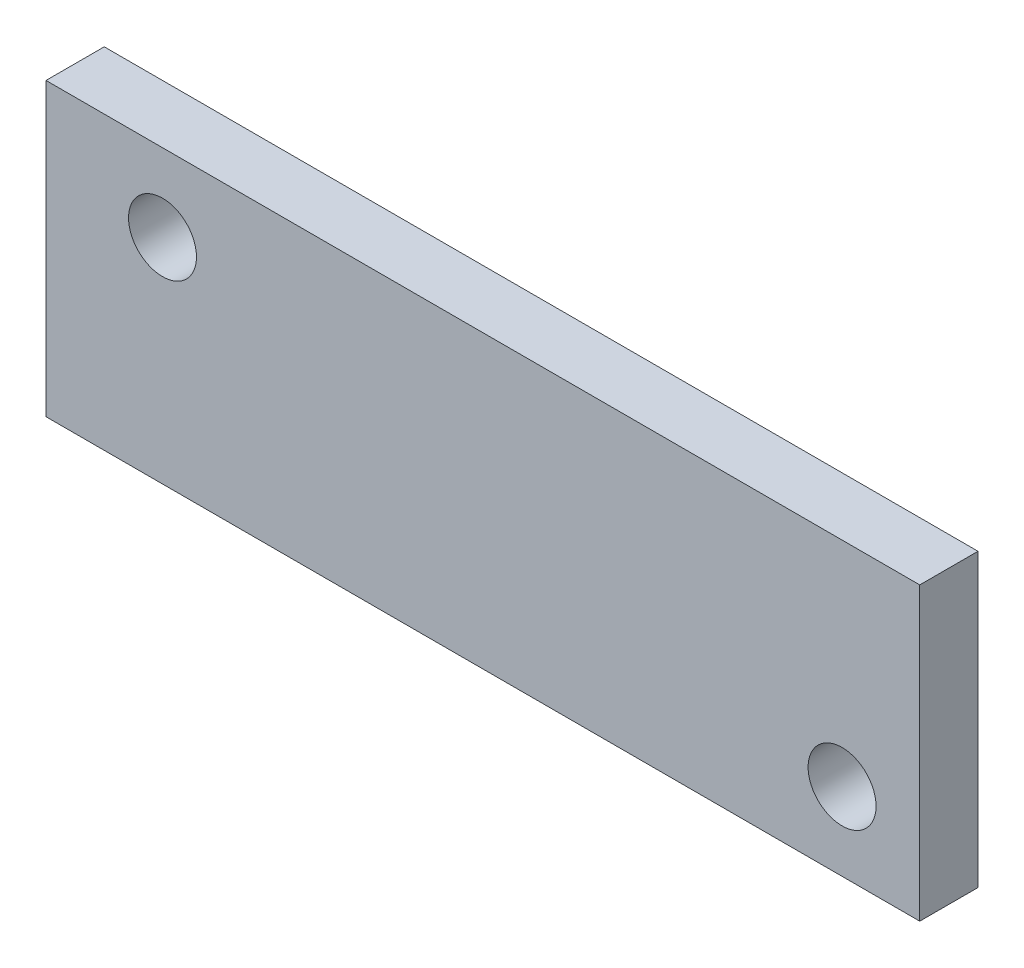
ISO-10303-21;
HEADER;
FILE_DESCRIPTION(('STEP AP214'),'2;1');
FILE_NAME('part.step','',(''),(''),'','','');
FILE_SCHEMA(('AUTOMOTIVE_DESIGN { 1 0 10303 214 1 1 1 1 }'));
ENDSEC;
DATA;
#1=APPLICATION_CONTEXT('core data for automotive mechanical design processes');
#2=APPLICATION_PROTOCOL_DEFINITION('international standard','automotive_design',2000,#1);
#3=PRODUCT_CONTEXT('',#1,'mechanical');
#4=PRODUCT('Part','Part','',(#3));
#5=PRODUCT_RELATED_PRODUCT_CATEGORY('part','',(#4));
#6=PRODUCT_DEFINITION_FORMATION('','',#4);
#7=PRODUCT_DEFINITION_CONTEXT('part definition',#1,'design');
#8=PRODUCT_DEFINITION('design','',#6,#7);
#9=PRODUCT_DEFINITION_SHAPE('','',#8);
#10=(LENGTH_UNIT() NAMED_UNIT(*) SI_UNIT(.MILLI.,.METRE.));
#11=(NAMED_UNIT(*) PLANE_ANGLE_UNIT() SI_UNIT($,.RADIAN.));
#12=(NAMED_UNIT(*) SI_UNIT($,.STERADIAN.) SOLID_ANGLE_UNIT());
#13=UNCERTAINTY_MEASURE_WITH_UNIT(LENGTH_MEASURE(1.E-05),#10,'distance_accuracy_value','');
#14=(GEOMETRIC_REPRESENTATION_CONTEXT(3) GLOBAL_UNCERTAINTY_ASSIGNED_CONTEXT((#13)) GLOBAL_UNIT_ASSIGNED_CONTEXT((#10,
#11,#12)) REPRESENTATION_CONTEXT('',''));
#15=CARTESIAN_POINT('',(0.,0.,0.));
#16=DIRECTION('',(0.,0.,1.));
#17=DIRECTION('',(1.,0.,0.));
#18=AXIS2_PLACEMENT_3D('',#15,#16,#17);
#19=CARTESIAN_POINT('',(-22.5,7.5,3.));
#20=DIRECTION('',(1.,0.,0.));
#21=DIRECTION('',(0.,1.,0.));
#22=AXIS2_PLACEMENT_3D('',#19,#20,#21);
#23=PLANE('',#22);
#24=DIRECTION('',(0.,-1.,0.));
#25=VECTOR('',#24,1.);
#26=CARTESIAN_POINT('',(-22.5,7.5,0.));
#27=LINE('',#26,#25);
#28=CARTESIAN_POINT('',(-22.5,7.5,0.));
#29=VERTEX_POINT('',#28);
#30=CARTESIAN_POINT('',(-22.5,-7.5,0.));
#31=VERTEX_POINT('',#30);
#32=EDGE_CURVE('E100',#29,#31,#27,.T.);
#33=ORIENTED_EDGE('',*,*,#32,.T.);
#34=DIRECTION('',(0.,0.,-1.));
#35=VECTOR('',#34,1.);
#36=CARTESIAN_POINT('',(-22.5,-7.5,3.));
#37=LINE('',#36,#35);
#38=CARTESIAN_POINT('',(-22.5,-7.5,3.));
#39=VERTEX_POINT('',#38);
#40=EDGE_CURVE('E11',#39,#31,#37,.T.);
#41=ORIENTED_EDGE('',*,*,#40,.F.);
#42=DIRECTION('',(0.,-1.,0.));
#43=VECTOR('',#42,1.);
#44=CARTESIAN_POINT('',(-22.5,7.5,3.));
#45=LINE('',#44,#43);
#46=CARTESIAN_POINT('',(-22.5,7.5,3.));
#47=VERTEX_POINT('',#46);
#48=EDGE_CURVE('E88',#47,#39,#45,.T.);
#49=ORIENTED_EDGE('',*,*,#48,.F.);
#50=DIRECTION('',(0.,0.,-1.));
#51=VECTOR('',#50,1.);
#52=CARTESIAN_POINT('',(-22.5,7.5,3.));
#53=LINE('',#52,#51);
#54=EDGE_CURVE('E96',#47,#29,#53,.T.);
#55=ORIENTED_EDGE('',*,*,#54,.T.);
#56=EDGE_LOOP('',(#33,#41,#49,#55));
#57=FACE_BOUND('',#56,.T.);
#58=ADVANCED_FACE('F37',(#57),#23,.F.);
#59=CARTESIAN_POINT('',(22.5,-7.5,3.));
#60=DIRECTION('',(0.,1.,0.));
#61=DIRECTION('',(-1.,0.,0.));
#62=AXIS2_PLACEMENT_3D('',#59,#60,#61);
#63=PLANE('',#62);
#64=DIRECTION('',(1.,0.,0.));
#65=VECTOR('',#64,1.);
#66=CARTESIAN_POINT('',(22.5,-7.5,0.));
#67=LINE('',#66,#65);
#68=CARTESIAN_POINT('',(22.5,-7.5,0.));
#69=VERTEX_POINT('',#68);
#70=EDGE_CURVE('E92',#31,#69,#67,.T.);
#71=ORIENTED_EDGE('',*,*,#70,.T.);
#72=DIRECTION('',(0.,0.,-1.));
#73=VECTOR('',#72,1.);
#74=CARTESIAN_POINT('',(22.5,-7.5,3.));
#75=LINE('',#74,#73);
#76=CARTESIAN_POINT('',(22.5,-7.5,3.));
#77=VERTEX_POINT('',#76);
#78=EDGE_CURVE('E45',#77,#69,#75,.T.);
#79=ORIENTED_EDGE('',*,*,#78,.F.);
#80=DIRECTION('',(1.,0.,0.));
#81=VECTOR('',#80,1.);
#82=CARTESIAN_POINT('',(22.5,-7.5,3.));
#83=LINE('',#82,#81);
#84=EDGE_CURVE('E83',#39,#77,#83,.T.);
#85=ORIENTED_EDGE('',*,*,#84,.F.);
#86=ORIENTED_EDGE('',*,*,#40,.T.);
#87=EDGE_LOOP('',(#71,#79,#85,#86));
#88=FACE_BOUND('',#87,.T.);
#89=ADVANCED_FACE('F91',(#88),#63,.F.);
#90=CARTESIAN_POINT('',(22.5,7.5,3.));
#91=DIRECTION('',(-1.,0.,0.));
#92=DIRECTION('',(0.,0.,1.));
#93=AXIS2_PLACEMENT_3D('',#90,#91,#92);
#94=PLANE('',#93);
#95=DIRECTION('',(0.,1.,0.));
#96=VECTOR('',#95,1.);
#97=CARTESIAN_POINT('',(22.5,7.5,0.));
#98=LINE('',#97,#96);
#99=CARTESIAN_POINT('',(22.5,7.5,0.));
#100=VERTEX_POINT('',#99);
#101=EDGE_CURVE('E70',#69,#100,#98,.T.);
#102=ORIENTED_EDGE('',*,*,#101,.T.);
#103=DIRECTION('',(0.,0.,-1.));
#104=VECTOR('',#103,1.);
#105=CARTESIAN_POINT('',(22.5,7.5,3.));
#106=LINE('',#105,#104);
#107=CARTESIAN_POINT('',(22.5,7.5,3.));
#108=VERTEX_POINT('',#107);
#109=EDGE_CURVE('E93',#108,#100,#106,.T.);
#110=ORIENTED_EDGE('',*,*,#109,.F.);
#111=DIRECTION('',(0.,1.,0.));
#112=VECTOR('',#111,1.);
#113=CARTESIAN_POINT('',(22.5,7.5,3.));
#114=LINE('',#113,#112);
#115=EDGE_CURVE('E86',#77,#108,#114,.T.);
#116=ORIENTED_EDGE('',*,*,#115,.F.);
#117=ORIENTED_EDGE('',*,*,#78,.T.);
#118=EDGE_LOOP('',(#102,#110,#116,#117));
#119=FACE_BOUND('',#118,.T.);
#120=ADVANCED_FACE('F94',(#119),#94,.F.);
#121=CARTESIAN_POINT('',(22.5,7.5,3.));
#122=DIRECTION('',(0.,-1.,0.));
#123=DIRECTION('',(1.,0.,0.));
#124=AXIS2_PLACEMENT_3D('',#121,#122,#123);
#125=PLANE('',#124);
#126=DIRECTION('',(-1.,0.,0.));
#127=VECTOR('',#126,1.);
#128=CARTESIAN_POINT('',(22.5,7.5,0.));
#129=LINE('',#128,#127);
#130=EDGE_CURVE('E76',#100,#29,#129,.T.);
#131=ORIENTED_EDGE('',*,*,#130,.T.);
#132=ORIENTED_EDGE('',*,*,#54,.F.);
#133=DIRECTION('',(-1.,0.,0.));
#134=VECTOR('',#133,1.);
#135=CARTESIAN_POINT('',(22.5,7.5,3.));
#136=LINE('',#135,#134);
#137=EDGE_CURVE('E53',#108,#47,#136,.T.);
#138=ORIENTED_EDGE('',*,*,#137,.F.);
#139=ORIENTED_EDGE('',*,*,#109,.T.);
#140=EDGE_LOOP('',(#131,#132,#138,#139));
#141=FACE_BOUND('',#140,.T.);
#142=ADVANCED_FACE('F108',(#141),#125,.F.);
#143=CARTESIAN_POINT('',(0.,0.,3.));
#144=DIRECTION('',(0.,0.,-1.));
#145=DIRECTION('',(-1.,0.,0.));
#146=AXIS2_PLACEMENT_3D('',#143,#144,#145);
#147=PLANE('',#146);
#148=CARTESIAN_POINT('',(18.5,-3.5,3.));
#149=DIRECTION('',(0.,0.,1.));
#150=DIRECTION('',(1.,0.,0.));
#151=AXIS2_PLACEMENT_3D('',#148,#149,#150);
#152=CIRCLE('',#151,1.75);
#153=CARTESIAN_POINT('',(20.25,-3.5,3.));
#154=VERTEX_POINT('',#153);
#155=EDGE_CURVE('E120',#154,#154,#152,.T.);
#156=ORIENTED_EDGE('',*,*,#155,.F.);
#157=EDGE_LOOP('',(#156));
#158=FACE_BOUND('',#157,.T.);
#159=CARTESIAN_POINT('',(-16.5,3.5,3.));
#160=DIRECTION('',(0.,0.,1.));
#161=DIRECTION('',(1.,0.,0.));
#162=AXIS2_PLACEMENT_3D('',#159,#160,#161);
#163=CIRCLE('',#162,1.75);
#164=CARTESIAN_POINT('',(-14.75,3.5,3.));
#165=VERTEX_POINT('',#164);
#166=EDGE_CURVE('E117',#165,#165,#163,.T.);
#167=ORIENTED_EDGE('',*,*,#166,.F.);
#168=EDGE_LOOP('',(#167));
#169=FACE_BOUND('',#168,.T.);
#170=ORIENTED_EDGE('',*,*,#48,.T.);
#171=ORIENTED_EDGE('',*,*,#84,.T.);
#172=ORIENTED_EDGE('',*,*,#115,.T.);
#173=ORIENTED_EDGE('',*,*,#137,.T.);
#174=EDGE_LOOP('',(#170,#171,#172,#173));
#175=FACE_BOUND('',#174,.T.);
#176=ADVANCED_FACE('F84',(#158,#169,#175),#147,.F.);
#177=CARTESIAN_POINT('',(0.,0.,0.));
#178=DIRECTION('',(0.,0.,-1.));
#179=DIRECTION('',(-1.,0.,0.));
#180=AXIS2_PLACEMENT_3D('',#177,#178,#179);
#181=PLANE('',#180);
#182=CARTESIAN_POINT('',(18.5,-3.5,0.));
#183=DIRECTION('',(0.,0.,1.));
#184=DIRECTION('',(1.,0.,0.));
#185=AXIS2_PLACEMENT_3D('',#182,#183,#184);
#186=CIRCLE('',#185,1.75);
#187=CARTESIAN_POINT('',(20.25,-3.5,0.));
#188=VERTEX_POINT('',#187);
#189=EDGE_CURVE('E103',#188,#188,#186,.T.);
#190=ORIENTED_EDGE('',*,*,#189,.T.);
#191=EDGE_LOOP('',(#190));
#192=FACE_BOUND('',#191,.T.);
#193=CARTESIAN_POINT('',(-16.5,3.5,0.));
#194=DIRECTION('',(0.,0.,1.));
#195=DIRECTION('',(1.,0.,0.));
#196=AXIS2_PLACEMENT_3D('',#193,#194,#195);
#197=CIRCLE('',#196,1.75);
#198=CARTESIAN_POINT('',(-14.75,3.5,0.));
#199=VERTEX_POINT('',#198);
#200=EDGE_CURVE('E114',#199,#199,#197,.T.);
#201=ORIENTED_EDGE('',*,*,#200,.T.);
#202=EDGE_LOOP('',(#201));
#203=FACE_BOUND('',#202,.T.);
#204=ORIENTED_EDGE('',*,*,#32,.F.);
#205=ORIENTED_EDGE('',*,*,#130,.F.);
#206=ORIENTED_EDGE('',*,*,#101,.F.);
#207=ORIENTED_EDGE('',*,*,#70,.F.);
#208=EDGE_LOOP('',(#204,#205,#206,#207));
#209=FACE_BOUND('',#208,.T.);
#210=ADVANCED_FACE('F111',(#192,#203,#209),#181,.T.);
#211=CARTESIAN_POINT('',(-16.5,3.5,0.));
#212=DIRECTION('',(0.,0.,1.));
#213=DIRECTION('',(1.,0.,0.));
#214=AXIS2_PLACEMENT_3D('',#211,#212,#213);
#215=CYLINDRICAL_SURFACE('',#214,1.75);
#216=ORIENTED_EDGE('',*,*,#200,.F.);
#217=EDGE_LOOP('',(#216));
#218=FACE_BOUND('',#217,.T.);
#219=ORIENTED_EDGE('',*,*,#166,.T.);
#220=EDGE_LOOP('',(#219));
#221=FACE_BOUND('',#220,.T.);
#222=ADVANCED_FACE('F131',(#218,#221),#215,.F.);
#223=CARTESIAN_POINT('',(18.5,-3.5,0.));
#224=DIRECTION('',(0.,0.,1.));
#225=DIRECTION('',(1.,0.,0.));
#226=AXIS2_PLACEMENT_3D('',#223,#224,#225);
#227=CYLINDRICAL_SURFACE('',#226,1.75);
#228=ORIENTED_EDGE('',*,*,#189,.F.);
#229=EDGE_LOOP('',(#228));
#230=FACE_BOUND('',#229,.T.);
#231=ORIENTED_EDGE('',*,*,#155,.T.);
#232=EDGE_LOOP('',(#231));
#233=FACE_BOUND('',#232,.T.);
#234=ADVANCED_FACE('F128',(#230,#233),#227,.F.);
#235=CLOSED_SHELL('',(#58,#89,#120,#142,#176,#210,#222,#234));
#236=MANIFOLD_SOLID_BREP('B2',#235);
#237=ADVANCED_BREP_SHAPE_REPRESENTATION('',(#18,#236),#14);
#238=SHAPE_DEFINITION_REPRESENTATION(#9,#237);
ENDSEC;
END-ISO-10303-21;
